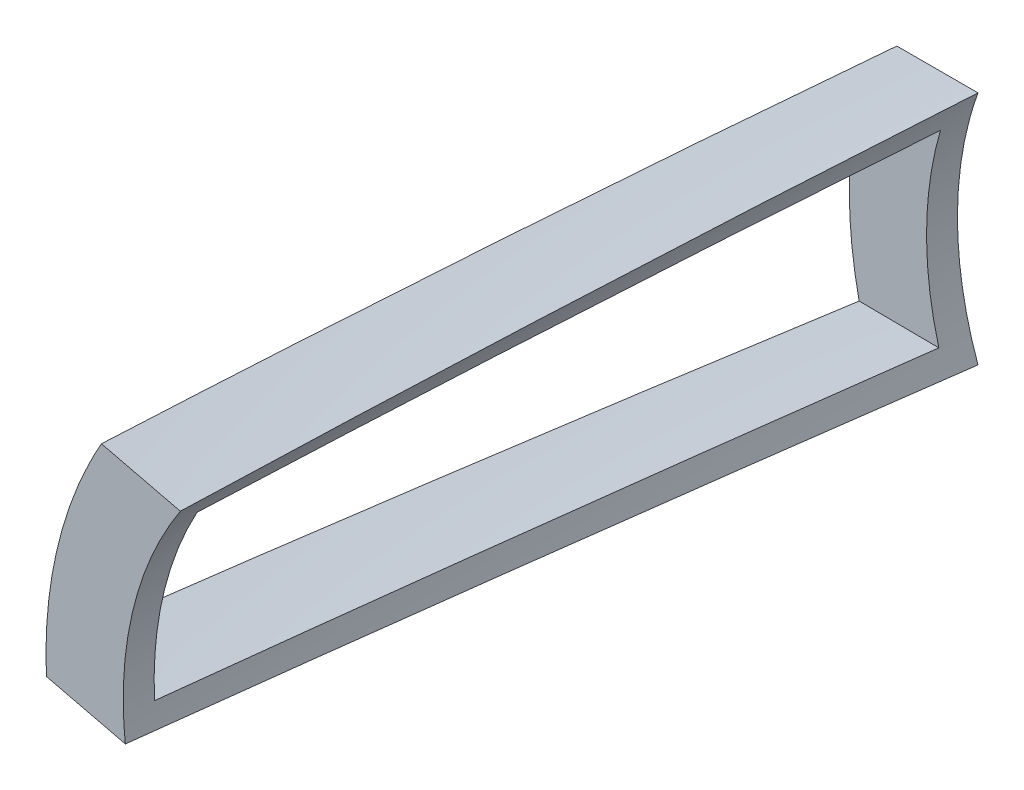
ISO-10303-21;
HEADER;
FILE_DESCRIPTION(('STEP AP214'),'2;1');
FILE_NAME('part.step','',(''),(''),'','','');
FILE_SCHEMA(('AUTOMOTIVE_DESIGN { 1 0 10303 214 1 1 1 1 }'));
ENDSEC;
DATA;
#1=APPLICATION_CONTEXT('core data for automotive mechanical design processes');
#2=APPLICATION_PROTOCOL_DEFINITION('international standard','automotive_design',2000,#1);
#3=PRODUCT_CONTEXT('',#1,'mechanical');
#4=PRODUCT('Part','Part','',(#3));
#5=PRODUCT_RELATED_PRODUCT_CATEGORY('part','',(#4));
#6=PRODUCT_DEFINITION_FORMATION('','',#4);
#7=PRODUCT_DEFINITION_CONTEXT('part definition',#1,'design');
#8=PRODUCT_DEFINITION('design','',#6,#7);
#9=PRODUCT_DEFINITION_SHAPE('','',#8);
#10=(LENGTH_UNIT() NAMED_UNIT(*) SI_UNIT(.MILLI.,.METRE.));
#11=(NAMED_UNIT(*) PLANE_ANGLE_UNIT() SI_UNIT($,.RADIAN.));
#12=(NAMED_UNIT(*) SI_UNIT($,.STERADIAN.) SOLID_ANGLE_UNIT());
#13=UNCERTAINTY_MEASURE_WITH_UNIT(LENGTH_MEASURE(1.E-05),#10,'distance_accuracy_value','');
#14=(GEOMETRIC_REPRESENTATION_CONTEXT(3) GLOBAL_UNCERTAINTY_ASSIGNED_CONTEXT((#13)) GLOBAL_UNIT_ASSIGNED_CONTEXT((#10,
#11,#12)) REPRESENTATION_CONTEXT('',''));
#15=CARTESIAN_POINT('',(0.,0.,0.));
#16=DIRECTION('',(0.,0.,1.));
#17=DIRECTION('',(1.,0.,0.));
#18=AXIS2_PLACEMENT_3D('',#15,#16,#17);
#19=CARTESIAN_POINT('',(-90.,0.,0.));
#20=DIRECTION('',(0.,0.,1.));
#21=DIRECTION('',(1.,0.,0.));
#22=AXIS2_PLACEMENT_3D('',#19,#20,#21);
#23=PLANE('',#22);
#24=CARTESIAN_POINT('',(-84.6743762894065,-30.5,0.));
#25=CARTESIAN_POINT('',(-91.8481142831322,-10.5842035973002,0.));
#26=CARTESIAN_POINT('',(-91.8481142831322,10.5842035973002,0.));
#27=CARTESIAN_POINT('',(-84.6743762894065,30.4999999999999,0.));
#28=(BOUNDED_CURVE() B_SPLINE_CURVE(3,(#24,#25,#26,#27),.UNSPECIFIED.,.F.,
.F.) B_SPLINE_CURVE_WITH_KNOTS((4,4),(0.,1.),
.UNSPECIFIED.) CURVE() GEOMETRIC_REPRESENTATION_ITEM() RATIONAL_B_SPLINE_CURVE((1.,
0.960550935477085,0.960550935477085,1.)) REPRESENTATION_ITEM(''));
#29=CARTESIAN_POINT('',(-84.6743762894065,-30.5,0.));
#30=VERTEX_POINT('',#29);
#31=CARTESIAN_POINT('',(-84.6743762894065,30.4999999999999,0.));
#32=VERTEX_POINT('',#31);
#33=EDGE_CURVE('E63',#30,#32,#28,.T.);
#34=ORIENTED_EDGE('',*,*,#33,.F.);
#35=CARTESIAN_POINT('',(-105.687037994259,-30.5,0.));
#36=CARTESIAN_POINT('',(-84.6743762894065,-30.5,0.));
#37=(BOUNDED_CURVE() B_SPLINE_CURVE(1,(#35,#36),.UNSPECIFIED.,.F.,
.F.) B_SPLINE_CURVE_WITH_KNOTS((2,2),(0.,1.),
.UNSPECIFIED.) CURVE() GEOMETRIC_REPRESENTATION_ITEM() RATIONAL_B_SPLINE_CURVE((1.,1.)) REPRESENTATION_ITEM(''));
#38=CARTESIAN_POINT('',(-105.687037994259,-30.4999999999999,0.));
#39=VERTEX_POINT('',#38);
#40=EDGE_CURVE('E300',#39,#30,#37,.T.);
#41=ORIENTED_EDGE('',*,*,#40,.F.);
#42=CARTESIAN_POINT('',(0.,0.,0.));
#43=DIRECTION('',(0.,0.,1.));
#44=DIRECTION('',(-0.960791254493266,0.277272727272727,0.));
#45=AXIS2_PLACEMENT_3D('',#42,#43,#44);
#46=CIRCLE('',#45,110.);
#47=CARTESIAN_POINT('',(-105.687037994259,30.5,0.));
#48=VERTEX_POINT('',#47);
#49=EDGE_CURVE('E295',#48,#39,#46,.T.);
#50=ORIENTED_EDGE('',*,*,#49,.F.);
#51=CARTESIAN_POINT('',(-84.6743762894065,30.5,0.));
#52=CARTESIAN_POINT('',(-105.687037994259,30.5,0.));
#53=(BOUNDED_CURVE() B_SPLINE_CURVE(1,(#51,#52),.UNSPECIFIED.,.F.,
.F.) B_SPLINE_CURVE_WITH_KNOTS((2,2),(0.,1.),
.UNSPECIFIED.) CURVE() GEOMETRIC_REPRESENTATION_ITEM() RATIONAL_B_SPLINE_CURVE((1.,1.)) REPRESENTATION_ITEM(''));
#54=EDGE_CURVE('E262',#32,#48,#53,.T.);
#55=ORIENTED_EDGE('',*,*,#54,.F.);
#56=EDGE_LOOP('',(#34,#41,#50,#55));
#57=FACE_BOUND('',#56,.T.);
#58=ADVANCED_FACE('F51',(#57),#23,.F.);
#59=CARTESIAN_POINT('',(-82.5484958033198,35.8572982893203,216.));
#60=DIRECTION('',(0.,0.,-1.));
#61=DIRECTION('',(-1.,0.,0.));
#62=AXIS2_PLACEMENT_3D('',#59,#60,#61);
#63=PLANE('',#62);
#64=CARTESIAN_POINT('',(-75.2147797046774,49.4240519785342,216.));
#65=CARTESIAN_POINT('',(-86.8395403434408,31.7331954914144,216.));
#66=CARTESIAN_POINT('',(-91.7811873850384,11.1496683963638,216.));
#67=CARTESIAN_POINT('',(-89.4548907704898,-9.89052664117212,216.));
#68=(BOUNDED_CURVE() B_SPLINE_CURVE(3,(#64,#65,#66,#67),.UNSPECIFIED.,.F.,
.F.) B_SPLINE_CURVE_WITH_KNOTS((4,4),(0.,1.),
.UNSPECIFIED.) CURVE() GEOMETRIC_REPRESENTATION_ITEM() RATIONAL_B_SPLINE_CURVE((0.999903611532343,
0.960458349444308,0.960458349444308,0.999903611532343)) REPRESENTATION_ITEM(''));
#69=CARTESIAN_POINT('',(-75.2147797046774,49.4240519785342,216.));
#70=VERTEX_POINT('',#69);
#71=CARTESIAN_POINT('',(-89.4548908369125,-9.8905260404119,216.000006156533));
#72=VERTEX_POINT('',#71);
#73=EDGE_CURVE('E12',#70,#72,#68,.T.);
#74=ORIENTED_EDGE('',*,*,#73,.F.);
#75=CARTESIAN_POINT('',(-95.6468640450545,54.329341964972,216.0000082815));
#76=CARTESIAN_POINT('',(-75.214779258191,49.4240526580085,216.0000082815));
#77=(BOUNDED_CURVE() B_SPLINE_CURVE(1,(#75,#76),.UNSPECIFIED.,.F.,
.F.) B_SPLINE_CURVE_WITH_KNOTS((2,2),(0.,1.),
.UNSPECIFIED.) CURVE() GEOMETRIC_REPRESENTATION_ITEM() RATIONAL_B_SPLINE_CURVE((0.999903611598851,0.999903611598851)) REPRESENTATION_ITEM(''));
#78=CARTESIAN_POINT('',(-95.6468640450545,54.329341964972,216.0000082815));
#79=VERTEX_POINT('',#78);
#80=EDGE_CURVE('E263',#79,#70,#77,.T.);
#81=ORIENTED_EDGE('',*,*,#80,.F.);
#82=CARTESIAN_POINT('',(-109.886975668626,-4.98523604283208,216.000012313066));
#83=CARTESIAN_POINT('',(-110.83322311462,15.8724062395083,216.000012313066));
#84=CARTESIAN_POINT('',(-105.959114025214,36.1746151437554,216.000012313066));
#85=CARTESIAN_POINT('',(-95.6468638061253,54.329342385607,216.000012313066));
#86=(BOUNDED_CURVE() B_SPLINE_CURVE(3,(#82,#83,#84,#85),.UNSPECIFIED.,.F.,
.F.) B_SPLINE_CURVE_WITH_KNOTS((4,4),(0.,1.),
.UNSPECIFIED.) CURVE() GEOMETRIC_REPRESENTATION_ITEM() RATIONAL_B_SPLINE_CURVE((0.999903611631228,
0.973766967471419,0.973766967471419,0.999903611631228)) REPRESENTATION_ITEM(''));
#87=CARTESIAN_POINT('',(-109.886975668626,-4.98523604283208,216.000012313066));
#88=VERTEX_POINT('',#87);
#89=EDGE_CURVE('E294',#88,#79,#86,.T.);
#90=ORIENTED_EDGE('',*,*,#89,.F.);
#91=CARTESIAN_POINT('',(-89.4548909033352,-9.89052543965167,216.000012313066));
#92=CARTESIAN_POINT('',(-109.886975668626,-4.98523604283213,216.000012313066));
#93=(BOUNDED_CURVE() B_SPLINE_CURVE(1,(#91,#92),.UNSPECIFIED.,.F.,
.F.) B_SPLINE_CURVE_WITH_KNOTS((2,2),(0.,1.),
.UNSPECIFIED.) CURVE() GEOMETRIC_REPRESENTATION_ITEM() RATIONAL_B_SPLINE_CURVE((0.999903611631228,0.999903611631228)) REPRESENTATION_ITEM(''));
#94=EDGE_CURVE('E316',#72,#88,#93,.T.);
#95=ORIENTED_EDGE('',*,*,#94,.F.);
#96=EDGE_LOOP('',(#74,#81,#90,#95));
#97=FACE_BOUND('',#96,.T.);
#98=ADVANCED_FACE('F53',(#97),#63,.F.);
#99=CARTESIAN_POINT('',(-84.6743762894065,-30.5,0.));
#100=CARTESIAN_POINT('',(-85.4231092637287,-28.4213607341624,22.5));
#101=CARTESIAN_POINT('',(-86.0689463618524,-26.3084866946119,45.));
#102=CARTESIAN_POINT('',(-86.7147834599761,-24.1956126550614,67.5));
#103=CARTESIAN_POINT('',(-87.2561688037633,-22.0535939404252,90.));
#104=CARTESIAN_POINT('',(-87.7975541475505,-19.911575225789,112.5));
#105=CARTESIAN_POINT('',(-88.2331834922882,-17.7455721467693,135.));
#106=CARTESIAN_POINT('',(-88.668812837026,-15.5795690677497,157.5));
#107=CARTESIAN_POINT('',(-88.9976367134661,-13.3947997154834,180.));
#108=CARTESIAN_POINT('',(-89.2606704549354,-11.6471527283015,197.998264746255));
#109=CARTESIAN_POINT('',(-89.4548907704898,-9.89052664117212,216.));
#110=CARTESIAN_POINT('',(-89.4665426557859,-9.78514113802853,217.079980504146));
#111=CARTESIAN_POINT('',(-89.4781945410821,-9.67975563488494,218.159961008292));
#112=CARTESIAN_POINT('',(-91.8481142831322,-10.5842035973002,0.));
#113=CARTESIAN_POINT('',(-92.1079418975662,-8.32945894834622,22.5));
#114=CARTESIAN_POINT('',(-92.2568214621332,-6.06468110130171,45.));
#115=CARTESIAN_POINT('',(-92.4057010267002,-3.7999032542572,67.5));
#116=CARTESIAN_POINT('',(-92.4432738774888,-1.53054825732683,90.));
#117=CARTESIAN_POINT('',(-92.4808467282774,0.738806739603545,112.5));
#118=CARTESIAN_POINT('',(-92.4070223489991,3.00727181146015,135.));
#119=CARTESIAN_POINT('',(-92.3331979697207,5.27573688331676,157.5));
#120=CARTESIAN_POINT('',(-92.1481542097713,7.53784709904742,180.));
#121=CARTESIAN_POINT('',(-92.0001334728286,9.34736081228869,197.998264746255));
#122=CARTESIAN_POINT('',(-91.7811873850384,11.1496683963638,216.));
#123=CARTESIAN_POINT('',(-91.7680521231907,11.2577944756466,217.079980504146));
#124=CARTESIAN_POINT('',(-91.7549168613429,11.3659205549295,218.159961008292));
#125=CARTESIAN_POINT('',(-91.8481142831322,10.5842035973002,0.));
#126=CARTESIAN_POINT('',(-91.5882866686981,12.8389482462542,22.5));
#127=CARTESIAN_POINT('',(-91.2181369518784,15.0782278197661,45.));
#128=CARTESIAN_POINT('',(-90.8479872350587,17.3175073932779,67.5));
#129=CARTESIAN_POINT('',(-90.3684071389424,19.5359272707174,90.));
#130=CARTESIAN_POINT('',(-89.8888270428261,21.7543471481568,112.5));
#131=CARTESIAN_POINT('',(-89.300971917871,23.9465629617284,135.));
#132=CARTESIAN_POINT('',(-88.713116792916,26.1387787752999,157.5));
#133=CARTESIAN_POINT('',(-88.0184028336082,28.2995092850934,180.));
#134=CARTESIAN_POINT('',(-87.4626852441619,30.0279270522299,197.998264746255));
#135=CARTESIAN_POINT('',(-86.8395403434408,31.7331954914144,216.));
#136=CARTESIAN_POINT('',(-86.8021559282969,31.8354998883347,217.079980504146));
#137=CARTESIAN_POINT('',(-86.764771513153,31.9378042852551,218.159961008292));
#138=CARTESIAN_POINT('',(-84.6743762894065,30.4999999999999,0.));
#139=CARTESIAN_POINT('',(-83.9256433150843,32.5786392658375,22.5));
#140=CARTESIAN_POINT('',(-83.0758182278799,34.6180361339035,45.));
#141=CARTESIAN_POINT('',(-82.2259931406756,36.6574330019696,67.5));
#142=CARTESIAN_POINT('',(-81.2771232436602,38.6526743865787,90.));
#143=CARTESIAN_POINT('',(-80.3282533466447,40.6479157711879,112.5));
#144=CARTESIAN_POINT('',(-79.2826245505112,42.5941949610822,135.));
#145=CARTESIAN_POINT('',(-78.2369957543777,44.5404741509765,157.5));
#146=CARTESIAN_POINT('',(-77.0971270704823,46.4331023891136,180.));
#147=CARTESIAN_POINT('',(-76.1853200327616,47.9470590156127,197.998264746255));
#148=CARTESIAN_POINT('',(-75.2147797046774,49.4240519785342,216.));
#149=CARTESIAN_POINT('',(-75.1565539493242,49.5126614143597,217.079980504146));
#150=CARTESIAN_POINT('',(-75.098328193971,49.6012708501853,218.159961008292));
#151=(BOUNDED_SURFACE() B_SPLINE_SURFACE(3,2,((#99,#100,#101,#102,#103,#104,#105,#106,#107,#108,
#109,#110,#111),(#112,#113,#114,#115,#116,#117,#118,#119,#120,#121,#122,#123,#124),(#125,#126,
#127,#128,#129,#130,#131,#132,#133,#134,#135,#136,#137),(#138,#139,#140,#141,#142,#143,#144,
#145,#146,#147,#148,#149,#150)),.UNSPECIFIED.,.F.,.F.,.F.) B_SPLINE_SURFACE_WITH_KNOTS((4,4),(3,
2,2,2,2,2,3),(0.,1.),(0.,0.0078125,0.015625,0.0234375,0.03125,0.0374997740895289,
0.0378747718304242),
.UNSPECIFIED.) GEOMETRIC_REPRESENTATION_ITEM() RATIONAL_B_SPLINE_SURFACE(((1.,0.999698818696204,
1.,0.999698818696204,1.,0.999698818696204,1.,0.999698818696204,1.,0.999759063666085,
0.999903611532343,0.999903611532343,0.999903611532343),(0.960550935477085,0.960261635493976,
0.960550935477085,0.960261635493976,0.960550935477085,0.960261635493976,0.960550935477085,
0.960261635493976,0.960550935477085,0.960319503856152,0.960458349444308,0.960458349444308,
0.960458349444308),(0.960550935477085,0.960261635493976,0.960550935477085,0.960261635493976,
0.960550935477085,0.960261635493976,0.960550935477085,0.960261635493976,0.960550935477085,
0.960319503856152,0.960458349444308,0.960458349444308,0.960458349444308),(1.,0.999698818696204,
1.,0.999698818696204,1.,0.999698818696204,1.,0.999698818696204,1.,0.999759063666085,
0.999903611532343,0.999903611532343,0.999903611532343))) REPRESENTATION_ITEM('') SURFACE());
#152=CARTESIAN_POINT('',(-86.6011197407635,-24.4999195844791,0.));
#153=CARTESIAN_POINT('',(-87.2025590083419,-22.3739814217533,22.5));
#154=CARTESIAN_POINT('',(-87.6989589745738,-20.2210928185403,45.));
#155=CARTESIAN_POINT('',(-88.1953589408056,-18.0682042153273,67.5));
#156=CARTESIAN_POINT('',(-88.5855237346928,-15.8935516688431,90.));
#157=CARTESIAN_POINT('',(-88.9756885285799,-13.7188991223589,112.5));
#158=CARTESIAN_POINT('',(-89.2586782089594,-11.527721561065,135.));
#159=CARTESIAN_POINT('',(-89.5416678893388,-9.33654399977105,157.5));
#160=CARTESIAN_POINT('',(-89.7168007092838,-7.13412016233707,180.));
#161=CARTESIAN_POINT('',(-89.8568934585782,-5.37235094857708,197.998264746255));
#162=CARTESIAN_POINT('',(-89.9277131377799,-3.60644004652252,216.));
#163=CARTESIAN_POINT('',(-89.9319618322402,-3.50049751823871,217.079980504146));
#164=CARTESIAN_POINT('',(-89.9362105267005,-3.39455498995491,218.159961008292));
#165=(BOUNDED_CURVE() B_SPLINE_CURVE(2,(#152,#153,#154,#155,#156,#157,#158,#159,#160,#161,#162,
#163,#164),.UNSPECIFIED.,.F.,.F.) B_SPLINE_CURVE_WITH_KNOTS((3,2,2,2,2,2,3),(0.,0.0078125,
0.015625,0.0234375,0.03125,0.0374997740895289,0.0378747718304242),
.UNSPECIFIED.) CURVE() GEOMETRIC_REPRESENTATION_ITEM() RATIONAL_B_SPLINE_CURVE((0.989089857107445,
0.98879196173471,0.989089857107445,0.98879196173471,0.989089857107445,0.98879196173471,
0.989089857107445,0.98879196173471,0.989089857107445,0.98885154942336,0.988994520251743,
0.988994520251743,0.988994520251743)) REPRESENTATION_ITEM(''));
#166=CARTESIAN_POINT('',(-86.8116434031464,-23.7431794342069,7.99998850867654));
#167=VERTEX_POINT('',#166);
#168=CARTESIAN_POINT('',(-89.8928189426009,-4.39102522798156,208.000007368579));
#169=VERTEX_POINT('',#168);
#170=EDGE_CURVE('E209',#167,#169,#165,.T.);
#171=CARTESIAN_POINT('',(-89.3651786248884,-10.6707473656625,207.999999999994));
#172=CARTESIAN_POINT('',(-91.8749866838556,10.3483469693357,207.999999999994));
#173=CARTESIAN_POINT('',(-87.1131428480972,30.9742119558098,207.999999999994));
#174=CARTESIAN_POINT('',(-75.6431979717875,48.7658343576829,207.999999999994));
#175=(BOUNDED_CURVE() B_SPLINE_CURVE(3,(#171,#172,#173,#174),.UNSPECIFIED.,.F.,
.F.) B_SPLINE_CURVE_WITH_KNOTS((4,4),(0.,1.),
.UNSPECIFIED.) CURVE() GEOMETRIC_REPRESENTATION_ITEM() RATIONAL_B_SPLINE_CURVE((0.999858405056304,
0.960414926321459,0.960414926321459,0.999858405056304)) REPRESENTATION_ITEM(''));
#176=CARTESIAN_POINT('',(-78.8701999503741,43.3531032313491,207.999999999994));
#177=VERTEX_POINT('',#176);
#178=EDGE_CURVE('E222',#177,#169,#175,.F.);
#179=CARTESIAN_POINT('',(-86.3839526884705,25.2549543241735,7.99999187350008));
#180=CARTESIAN_POINT('',(-85.8742408010512,26.9984113505613,26.5016252924337));
#181=CARTESIAN_POINT('',(-85.2945974872217,28.719882302907,45.));
#182=CARTESIAN_POINT('',(-84.5895639495548,30.8137471445538,67.5));
#183=CARTESIAN_POINT('',(-83.7826385775253,32.8704954782821,90.));
#184=CARTESIAN_POINT('',(-82.9757132054959,34.9272438120105,112.5));
#185=CARTESIAN_POINT('',(-82.0688399530033,36.9419207509346,135.));
#186=CARTESIAN_POINT('',(-81.1619667005107,38.9565976898588,157.5));
#187=CARTESIAN_POINT('',(-80.1573303046531,40.924349700768,180.));
#188=CARTESIAN_POINT('',(-79.5323117392318,42.1485553377868,193.998017372217));
#189=CARTESIAN_POINT('',(-78.8701999503741,43.3531032313491,207.999999999994));
#190=(BOUNDED_CURVE() B_SPLINE_CURVE(2,(#179,#180,#181,#182,#183,#184,#185,#186,#187,#188,#189),
.UNSPECIFIED.,.F.,.F.) B_SPLINE_CURVE_WITH_KNOTS((3,2,2,2,2,3),(0.00138910915697438,0.0078125,
0.015625,0.0234375,0.03125,0.0361109759076047),
.UNSPECIFIED.) CURVE() GEOMETRIC_REPRESENTATION_ITEM() RATIONAL_B_SPLINE_CURVE((0.999911940002985,
0.999752370530702,1.,0.999698818696204,1.,0.999698818696204,1.,0.999698818696204,1.,
0.999812603512119,0.999858405056304)) REPRESENTATION_ITEM(''));
#191=CARTESIAN_POINT('',(-86.3839526720266,25.2549543804195,7.99999247038403));
#192=VERTEX_POINT('',#191);
#193=EDGE_CURVE('E142',#192,#177,#190,.T.);
#194=CARTESIAN_POINT('',(-84.4049640862374,31.2378302319636,7.99999187350008));
#195=CARTESIAN_POINT('',(-91.7522430887485,11.3854007983736,7.99999187350008));
#196=CARTESIAN_POINT('',(-91.9369894136085,-9.78220019824056,7.99999187350008));
#197=CARTESIAN_POINT('',(-84.9373388517478,-29.7598465853467,7.99999187350008));
#198=(BOUNDED_CURVE() B_SPLINE_CURVE(3,(#194,#195,#196,#197),.UNSPECIFIED.,.F.,
.F.) B_SPLINE_CURVE_WITH_KNOTS((4,4),(0.,1.),
.UNSPECIFIED.) CURVE() GEOMETRIC_REPRESENTATION_ITEM() RATIONAL_B_SPLINE_CURVE((0.999911940002985,
0.960466349364574,0.960466349364574,0.999911940002985)) REPRESENTATION_ITEM(''));
#199=EDGE_CURVE('E70',#167,#192,#198,.F.);
#200=CARTESIAN_POINT('',(-84.6743762894065,30.4999999999999,0.));
#201=CARTESIAN_POINT('',(-83.9256433150843,32.5786392658375,22.5));
#202=CARTESIAN_POINT('',(-83.0758182278799,34.6180361339035,45.));
#203=CARTESIAN_POINT('',(-82.2259931406756,36.6574330019695,67.5));
#204=CARTESIAN_POINT('',(-81.2771232436602,38.6526743865787,90.));
#205=CARTESIAN_POINT('',(-80.3282533466447,40.6479157711879,112.5));
#206=CARTESIAN_POINT('',(-79.2826245505112,42.5941949610822,135.));
#207=CARTESIAN_POINT('',(-78.2369957543777,44.5404741509765,157.5));
#208=CARTESIAN_POINT('',(-77.0971270704823,46.4331023891136,180.));
#209=CARTESIAN_POINT('',(-76.1853200327617,47.9470590156127,197.998264746255));
#210=CARTESIAN_POINT('',(-75.2147797046775,49.4240519785341,216.));
#211=CARTESIAN_POINT('',(-75.1565539493242,49.5126614143597,217.079980504146));
#212=CARTESIAN_POINT('',(-75.098328193971,49.6012708501853,218.159961008292));
#213=(BOUNDED_CURVE() B_SPLINE_CURVE(2,(#200,#201,#202,#203,#204,#205,#206,#207,#208,#209,#210,
#211,#212),.UNSPECIFIED.,.F.,.F.) B_SPLINE_CURVE_WITH_KNOTS((3,2,2,2,2,2,3),(0.,0.0078125,
0.015625,0.0234375,0.03125,0.0374997740895289,0.0378747718304242),
.UNSPECIFIED.) CURVE() GEOMETRIC_REPRESENTATION_ITEM() RATIONAL_B_SPLINE_CURVE((1.,
0.999698818696204,1.,0.999698818696204,1.,0.999698818696204,1.,0.999698818696204,1.,
0.999759063666085,0.999903611532343,0.999903611532343,0.999903611532343)) REPRESENTATION_ITEM(''));
#214=EDGE_CURVE('E283',#32,#70,#213,.T.);
#215=CARTESIAN_POINT('',(-84.6743762894065,-30.5,0.));
#216=CARTESIAN_POINT('',(-85.4231092637287,-28.4213607341624,22.5));
#217=CARTESIAN_POINT('',(-86.0689463618524,-26.3084866946119,45.));
#218=CARTESIAN_POINT('',(-86.7147834599761,-24.1956126550614,67.5));
#219=CARTESIAN_POINT('',(-87.2561688037633,-22.0535939404252,90.));
#220=CARTESIAN_POINT('',(-87.7975541475505,-19.911575225789,112.5));
#221=CARTESIAN_POINT('',(-88.2331834922882,-17.7455721467693,135.));
#222=CARTESIAN_POINT('',(-88.668812837026,-15.5795690677497,157.5));
#223=CARTESIAN_POINT('',(-88.9976367134661,-13.3947997154834,180.));
#224=CARTESIAN_POINT('',(-89.2606705449267,-11.6471521303816,197.998270903975));
#225=CARTESIAN_POINT('',(-89.4548909033352,-9.89052543965167,216.000012313066));
#226=(BOUNDED_CURVE() B_SPLINE_CURVE(2,(#215,#216,#217,#218,#219,#220,#221,#222,#223,#224,#225),
.UNSPECIFIED.,.F.,.F.) B_SPLINE_CURVE_WITH_KNOTS((3,2,2,2,2,3),(0.,0.0078125,0.015625,0.0234375,
0.03125,0.0374997762272397),
.UNSPECIFIED.) CURVE() GEOMETRIC_REPRESENTATION_ITEM() RATIONAL_B_SPLINE_CURVE((1.,
0.999698818696204,1.,0.999698818696204,1.,0.999698818696204,1.,0.999698818696204,1.,
0.999759063583673,0.999903611631228)) REPRESENTATION_ITEM(''));
#227=EDGE_CURVE('E306',#30,#72,#226,.T.);
#228=ORIENTED_EDGE('',*,*,#170,.T.);
#229=ORIENTED_EDGE('',*,*,#178,.F.);
#230=ORIENTED_EDGE('',*,*,#193,.F.);
#231=ORIENTED_EDGE('',*,*,#199,.F.);
#232=EDGE_LOOP('',(#228,#229,#230,#231));
#233=FACE_BOUND('',#232,.T.);
#234=ORIENTED_EDGE('',*,*,#33,.T.);
#235=ORIENTED_EDGE('',*,*,#214,.T.);
#236=ORIENTED_EDGE('',*,*,#73,.T.);
#237=ORIENTED_EDGE('',*,*,#227,.F.);
#238=EDGE_LOOP('',(#234,#235,#236,#237));
#239=FACE_BOUND('',#238,.T.);
#240=ADVANCED_FACE('F260',(#233,#239),#151,.T.);
#241=CARTESIAN_POINT('',(-105.687037994259,-30.5,0.));
#242=CARTESIAN_POINT('',(-106.435770968581,-27.9055288424673,22.5));
#243=CARTESIAN_POINT('',(-107.056297395436,-25.277444253326,45.));
#244=CARTESIAN_POINT('',(-107.67682382229,-22.6493596641847,67.5));
#245=CARTESIAN_POINT('',(-108.167648799163,-19.9939929294031,90.));
#246=CARTESIAN_POINT('',(-108.658473776035,-17.3386261946215,112.5));
#247=CARTESIAN_POINT('',(-109.018414862565,-14.6623743252463,135.));
#248=CARTESIAN_POINT('',(-109.378355949095,-11.9861224558711,157.5));
#249=CARTESIAN_POINT('',(-109.606546015678,-9.29543277706768,180.));
#250=CARTESIAN_POINT('',(-109.789080532832,-7.14308781006177,197.998270903975));
#251=CARTESIAN_POINT('',(-109.886975668626,-4.98523604283213,216.000012313066));
#252=CARTESIAN_POINT('',(-84.6743762894065,-30.5,0.));
#253=CARTESIAN_POINT('',(-85.4231092637287,-28.4213607341624,22.5));
#254=CARTESIAN_POINT('',(-86.0689463618524,-26.3084866946119,45.));
#255=CARTESIAN_POINT('',(-86.7147834599761,-24.1956126550614,67.5));
#256=CARTESIAN_POINT('',(-87.2561688037633,-22.0535939404252,90.));
#257=CARTESIAN_POINT('',(-87.7975541475505,-19.911575225789,112.5));
#258=CARTESIAN_POINT('',(-88.2331834922882,-17.7455721467693,135.));
#259=CARTESIAN_POINT('',(-88.668812837026,-15.5795690677497,157.5));
#260=CARTESIAN_POINT('',(-88.9976367134661,-13.3947997154834,180.));
#261=CARTESIAN_POINT('',(-89.2606705449267,-11.6471521303816,197.998270903975));
#262=CARTESIAN_POINT('',(-89.4548909033352,-9.89052543965167,216.000012313066));
#263=(BOUNDED_SURFACE() B_SPLINE_SURFACE(1,2,((#241,#242,#243,#244,#245,#246,#247,#248,#249,
#250,#251),(#252,#253,#254,#255,#256,#257,#258,#259,#260,#261,#262)),.UNSPECIFIED.,.F.,.F.,
.F.) B_SPLINE_SURFACE_WITH_KNOTS((2,2),(3,2,2,2,2,3),(0.,1.),(0.,0.0078125,0.015625,0.0234375,
0.03125,0.0374997762272397),
.UNSPECIFIED.) GEOMETRIC_REPRESENTATION_ITEM() RATIONAL_B_SPLINE_SURFACE(((1.,0.999698818696204,
1.,0.999698818696204,1.,0.999698818696204,1.,0.999698818696204,1.,0.999759063583673,
0.999903611631228),(1.,0.999698818696204,1.,0.999698818696204,1.,0.999698818696204,1.,
0.999698818696204,1.,0.999759063583673,0.999903611631228))) REPRESENTATION_ITEM('') SURFACE());
#264=CARTESIAN_POINT('',(-105.687037994259,-30.4999999999999,0.));
#265=CARTESIAN_POINT('',(-106.435770968582,-27.9055288424672,22.5));
#266=CARTESIAN_POINT('',(-107.056297395436,-25.2774442533259,45.));
#267=CARTESIAN_POINT('',(-107.67682382229,-22.6493596641846,67.5));
#268=CARTESIAN_POINT('',(-108.167648799163,-19.993992929403,90.));
#269=CARTESIAN_POINT('',(-108.658473776035,-17.3386261946214,112.5));
#270=CARTESIAN_POINT('',(-109.018414862565,-14.6623743252462,135.));
#271=CARTESIAN_POINT('',(-109.378355949095,-11.9861224558711,157.5));
#272=CARTESIAN_POINT('',(-109.606546015678,-9.29543277706764,180.));
#273=CARTESIAN_POINT('',(-109.789080532832,-7.14308781006173,197.998270903975));
#274=CARTESIAN_POINT('',(-109.886975668626,-4.98523604283208,216.000012313066));
#275=(BOUNDED_CURVE() B_SPLINE_CURVE(2,(#264,#265,#266,#267,#268,#269,#270,#271,#272,#273,#274),
.UNSPECIFIED.,.F.,.F.) B_SPLINE_CURVE_WITH_KNOTS((3,2,2,2,2,3),(0.,0.0078125,0.015625,0.0234375,
0.03125,0.0374997762272397),
.UNSPECIFIED.) CURVE() GEOMETRIC_REPRESENTATION_ITEM() RATIONAL_B_SPLINE_CURVE((1.,
0.999698818696204,1.,0.999698818696204,1.,0.999698818696204,1.,0.999698818696204,1.,
0.999759063583673,0.999903611631228)) REPRESENTATION_ITEM(''));
#276=EDGE_CURVE('E288',#39,#88,#275,.T.);
#277=ORIENTED_EDGE('',*,*,#40,.T.);
#278=ORIENTED_EDGE('',*,*,#227,.T.);
#279=ORIENTED_EDGE('',*,*,#94,.T.);
#280=ORIENTED_EDGE('',*,*,#276,.F.);
#281=EDGE_LOOP('',(#277,#278,#279,#280));
#282=FACE_BOUND('',#281,.T.);
#283=ADVANCED_FACE('F173',(#282),#263,.T.);
#284=CARTESIAN_POINT('',(-105.687037994259,30.5,0.));
#285=CARTESIAN_POINT('',(-104.938305019937,33.0944711575327,22.5));
#286=CARTESIAN_POINT('',(-104.063169261463,35.6490785751895,45.));
#287=CARTESIAN_POINT('',(-103.18803350299,38.2036859928463,67.5));
#288=CARTESIAN_POINT('',(-102.188603239059,40.7122753976009,90.));
#289=CARTESIAN_POINT('',(-101.189172975129,43.2208648023555,112.5));
#290=CARTESIAN_POINT('',(-100.067855920788,45.6773927826053,135.));
#291=CARTESIAN_POINT('',(-98.9465388664469,48.1339207628551,157.5));
#292=CARTESIAN_POINT('',(-97.7060363726945,50.5324693275293,180.));
#293=CARTESIAN_POINT('',(-96.7137297087118,52.4511238539002,197.998270903975));
#294=CARTESIAN_POINT('',(-95.6468638061253,54.329342385607,216.000012313066));
#295=CARTESIAN_POINT('',(-111.476241726008,10.4395477129893,0.));
#296=CARTESIAN_POINT('',(-111.219965214214,13.1761358452443,22.5));
#297=CARTESIAN_POINT('',(-110.82971938346,15.8968527448271,45.));
#298=CARTESIAN_POINT('',(-110.439473552706,18.6175696444099,67.5));
#299=CARTESIAN_POINT('',(-109.91619853938,21.3158608660028,90.));
#300=CARTESIAN_POINT('',(-109.392923526054,24.0141520875956,112.5));
#301=CARTESIAN_POINT('',(-108.737879945496,26.6835172113033,135.));
#302=CARTESIAN_POINT('',(-108.082836364939,29.352882335011,157.5));
#303=CARTESIAN_POINT('',(-107.297602274511,31.9868906264418,180.));
#304=CARTESIAN_POINT('',(-106.669475346397,34.0938948394412,197.998270903975));
#305=CARTESIAN_POINT('',(-105.959114025214,36.1746151437554,216.000012313066));
#306=CARTESIAN_POINT('',(-111.476241726008,-10.4395477129893,0.));
#307=CARTESIAN_POINT('',(-111.732518237802,-7.7029595807343,22.5));
#308=CARTESIAN_POINT('',(-111.854208038073,-4.95709289631453,45.));
#309=CARTESIAN_POINT('',(-111.975897838343,-2.21122621189475,67.5));
#310=CARTESIAN_POINT('',(-111.962707765702,0.53730399133752,90.));
#311=CARTESIAN_POINT('',(-111.949517693061,3.28583419456979,112.5));
#312=CARTESIAN_POINT('',(-111.801479523549,6.03040646661217,135.));
#313=CARTESIAN_POINT('',(-111.653441354037,8.77497873865454,157.5));
#314=CARTESIAN_POINT('',(-111.370911724571,11.5089811645075,180.));
#315=CARTESIAN_POINT('',(-111.144909733036,13.6959730006242,197.998270903975));
#316=CARTESIAN_POINT('',(-110.83322311462,15.8724062395083,216.000012313066));
#317=CARTESIAN_POINT('',(-105.687037994259,-30.4999999999999,0.));
#318=CARTESIAN_POINT('',(-106.435770968582,-27.9055288424672,22.5));
#319=CARTESIAN_POINT('',(-107.056297395436,-25.2774442533259,45.));
#320=CARTESIAN_POINT('',(-107.67682382229,-22.6493596641846,67.5));
#321=CARTESIAN_POINT('',(-108.167648799163,-19.993992929403,90.));
#322=CARTESIAN_POINT('',(-108.658473776035,-17.3386261946214,112.5));
#323=CARTESIAN_POINT('',(-109.018414862565,-14.6623743252462,135.));
#324=CARTESIAN_POINT('',(-109.378355949095,-11.9861224558711,157.5));
#325=CARTESIAN_POINT('',(-109.606546015678,-9.29543277706764,180.));
#326=CARTESIAN_POINT('',(-109.789080532832,-7.14308781006173,197.998270903975));
#327=CARTESIAN_POINT('',(-109.886975668626,-4.98523604283208,216.000012313066));
#328=(BOUNDED_SURFACE() B_SPLINE_SURFACE(3,2,((#284,#285,#286,#287,#288,#289,#290,#291,#292,
#293,#294),(#295,#296,#297,#298,#299,#300,#301,#302,#303,#304,#305),(#306,#307,#308,#309,#310,
#311,#312,#313,#314,#315,#316),(#317,#318,#319,#320,#321,#322,#323,#324,#325,#326,#327)),
.UNSPECIFIED.,.F.,.F.,.F.) B_SPLINE_SURFACE_WITH_KNOTS((4,4),(3,2,2,2,2,3),(0.,1.),(0.,
0.0078125,0.015625,0.0234375,0.03125,0.0374997762272397),
.UNSPECIFIED.) GEOMETRIC_REPRESENTATION_ITEM() RATIONAL_B_SPLINE_SURFACE(((1.,0.999698818696204,
1.,0.999698818696204,1.,0.999698818696204,1.,0.999698818696204,1.,0.999759063583673,
0.999903611631228),(0.973860836328844,0.973567527652443,0.973860836328844,0.973567527652443,
0.973860836328844,0.973567527652443,0.973860836328844,0.973567527652443,0.973860836328844,
0.973626197788938,0.973766967471419),(0.973860836328844,0.973567527652443,0.973860836328844,
0.973567527652443,0.973860836328844,0.973567527652443,0.973860836328844,0.973567527652443,
0.973860836328844,0.973626197788938,0.973766967471419),(1.,0.999698818696204,1.,
0.999698818696204,1.,0.999698818696204,1.,0.999698818696204,1.,0.999759063583673,0.999903611631228))) REPRESENTATION_ITEM('') SURFACE());
#329=CARTESIAN_POINT('',(-105.949200552366,-29.5764585830425,8.));
#330=CARTESIAN_POINT('',(-111.563106926165,-9.4662452317788,8.));
#331=CARTESIAN_POINT('',(-111.380885371714,11.412055013026,8.));
#332=CARTESIAN_POINT('',(-105.41682524612,31.4212182295484,8.));
#333=(BOUNDED_CURVE() B_SPLINE_CURVE(3,(#329,#330,#331,#332),.UNSPECIFIED.,.F.,
.F.) B_SPLINE_CURVE_WITH_KNOTS((4,4),(0.,1.),
.UNSPECIFIED.) CURVE() GEOMETRIC_REPRESENTATION_ITEM() RATIONAL_B_SPLINE_CURVE((0.999911939932886,
0.973775078078237,0.973775078078237,0.999911939932886)) REPRESENTATION_ITEM(''));
#334=CARTESIAN_POINT('',(-107.018956910922,25.4350714899386,7.99999247038403));
#335=VERTEX_POINT('',#334);
#336=CARTESIAN_POINT('',(-107.446647790506,-23.5630617404218,7.99999425433827));
#337=VERTEX_POINT('',#336);
#338=EDGE_CURVE('E125',#335,#337,#333,.F.);
#339=CARTESIAN_POINT('',(-107.236864560186,24.5000995773541,0.));
#340=CARTESIAN_POINT('',(-106.635420874031,27.1326168415881,22.5));
#341=CARTESIAN_POINT('',(-105.905530153353,29.7324516805682,45.));
#342=CARTESIAN_POINT('',(-105.175639432674,32.3322865195483,67.5));
#343=CARTESIAN_POINT('',(-104.319060048151,34.8931757034286,90.));
#344=CARTESIAN_POINT('',(-103.462480663627,37.4540648873089,112.5));
#345=CARTESIAN_POINT('',(-102.481276190022,39.9698390097382,135.));
#346=CARTESIAN_POINT('',(-101.500071716418,42.4856131321675,157.5));
#347=CARTESIAN_POINT('',(-100.396605961252,44.950211472929,180.));
#348=CARTESIAN_POINT('',(-99.5139181570424,46.9217007443295,197.998270903975));
#349=CARTESIAN_POINT('',(-98.5545123729696,48.8570168033844,216.000012313066));
#350=(BOUNDED_CURVE() B_SPLINE_CURVE(2,(#339,#340,#341,#342,#343,#344,#345,#346,#347,#348,#349),
.UNSPECIFIED.,.F.,.F.) B_SPLINE_CURVE_WITH_KNOTS((3,2,2,2,2,3),(0.,0.0078125,0.015625,0.0234375,
0.03125,0.0374997762272397),
.UNSPECIFIED.) CURVE() GEOMETRIC_REPRESENTATION_ITEM() RATIONAL_B_SPLINE_CURVE((0.992865729446681,
0.992566696851793,0.992865729446681,0.992566696851793,0.992865729446681,0.992566696851793,
0.992865729446681,0.992566696851793,0.992865729446681,0.992626511935935,0.99277002873861)) REPRESENTATION_ITEM(''));
#351=CARTESIAN_POINT('',(-98.9770943600188,47.9951538391942,208.000004955951));
#352=VERTEX_POINT('',#351);
#353=EDGE_CURVE('E136',#335,#352,#350,.T.);
#354=CARTESIAN_POINT('',(-96.1173087655521,53.4926439397747,208.000007368579));
#355=CARTESIAN_POINT('',(-106.270745287429,35.2486215597364,208.000007368579));
#356=CARTESIAN_POINT('',(-110.967508458963,14.9046533746049,208.000007368579));
#357=CARTESIAN_POINT('',(-109.839289896358,-5.9439376732841,208.000007368579));
#358=(BOUNDED_CURVE() B_SPLINE_CURVE(3,(#354,#355,#356,#357),.UNSPECIFIED.,.F.,
.F.) B_SPLINE_CURVE_WITH_KNOTS((4,4),(0.,1.),
.UNSPECIFIED.) CURVE() GEOMETRIC_REPRESENTATION_ITEM() RATIONAL_B_SPLINE_CURVE((0.999858405080408,
0.973722942582031,0.973722942582031,0.999858405080408)) REPRESENTATION_ITEM(''));
#359=CARTESIAN_POINT('',(-109.999713574382,0.251025006430033,208.000007368579));
#360=VERTEX_POINT('',#359);
#361=EDGE_CURVE('E79',#360,#352,#358,.F.);
#362=CARTESIAN_POINT('',(-107.44664764282,-23.5630624138651,7.99998850867654));
#363=CARTESIAN_POINT('',(-107.922212712341,-21.39450420362,26.5016236096331));
#364=CARTESIAN_POINT('',(-108.309891640705,-19.2085234408791,45.));
#365=CARTESIAN_POINT('',(-108.781434423925,-16.5496648403328,67.5));
#366=CARTESIAN_POINT('',(-109.121945205318,-13.8708714436966,90.));
#367=CARTESIAN_POINT('',(-109.462455986711,-11.1920780470604,112.5));
#368=CARTESIAN_POINT('',(-109.671114445978,-8.49980330226133,135.));
#369=CARTESIAN_POINT('',(-109.879772905246,-5.80752855746229,157.5));
#370=CARTESIAN_POINT('',(-109.956076365883,-3.10825839017608,180.));
#371=CARTESIAN_POINT('',(-110.003547363602,-1.42894991735902,193.998021056326));
#372=CARTESIAN_POINT('',(-109.999713574382,0.251025006429975,208.000007368579));
#373=(BOUNDED_CURVE() B_SPLINE_CURVE(2,(#362,#363,#364,#365,#366,#367,#368,#369,#370,#371,#372),
.UNSPECIFIED.,.F.,.F.) B_SPLINE_CURVE_WITH_KNOTS((3,2,2,2,2,3),(0.001389108572782,0.0078125,
0.015625,0.0234375,0.03125,0.0361109771867149),
.UNSPECIFIED.) CURVE() GEOMETRIC_REPRESENTATION_ITEM() RATIONAL_B_SPLINE_CURVE((0.99991194003201,
0.99975237050818,1.,0.999698818696204,1.,0.999698818696204,1.,0.999698818696204,1.,
0.999812603462808,0.999858405080408)) REPRESENTATION_ITEM(''));
#374=EDGE_CURVE('E149',#337,#360,#373,.T.);
#375=CARTESIAN_POINT('',(-105.687037994259,30.5,0.));
#376=CARTESIAN_POINT('',(-104.938305019937,33.0944711575327,22.5));
#377=CARTESIAN_POINT('',(-104.063169261463,35.6490785751895,45.));
#378=CARTESIAN_POINT('',(-103.18803350299,38.2036859928463,67.5));
#379=CARTESIAN_POINT('',(-102.188603239059,40.7122753976009,90.));
#380=CARTESIAN_POINT('',(-101.189172975129,43.2208648023555,112.5));
#381=CARTESIAN_POINT('',(-100.067855920788,45.6773927826053,135.));
#382=CARTESIAN_POINT('',(-98.9465388664469,48.1339207628551,157.5));
#383=CARTESIAN_POINT('',(-97.7060363726945,50.5324693275293,180.));
#384=CARTESIAN_POINT('',(-96.7137298198703,52.451123638972,197.998268887803));
#385=CARTESIAN_POINT('',(-95.6468640450545,54.329341964972,216.0000082815));
#386=(BOUNDED_CURVE() B_SPLINE_CURVE(2,(#375,#376,#377,#378,#379,#380,#381,#382,#383,#384,#385),
.UNSPECIFIED.,.F.,.F.) B_SPLINE_CURVE_WITH_KNOTS((3,2,2,2,2,3),(0.,0.0078125,0.015625,0.0234375,
0.03125,0.0374997755273066),
.UNSPECIFIED.) CURVE() GEOMETRIC_REPRESENTATION_ITEM() RATIONAL_B_SPLINE_CURVE((1.,
0.999698818696204,1.,0.999698818696204,1.,0.999698818696204,1.,0.999698818696204,1.,
0.999759063610657,0.999903611598851)) REPRESENTATION_ITEM(''));
#387=EDGE_CURVE('E269',#48,#79,#386,.T.);
#388=ORIENTED_EDGE('',*,*,#338,.F.);
#389=ORIENTED_EDGE('',*,*,#353,.T.);
#390=ORIENTED_EDGE('',*,*,#361,.F.);
#391=ORIENTED_EDGE('',*,*,#374,.F.);
#392=EDGE_LOOP('',(#388,#389,#390,#391));
#393=FACE_BOUND('',#392,.T.);
#394=ORIENTED_EDGE('',*,*,#49,.T.);
#395=ORIENTED_EDGE('',*,*,#276,.T.);
#396=ORIENTED_EDGE('',*,*,#89,.T.);
#397=ORIENTED_EDGE('',*,*,#387,.F.);
#398=EDGE_LOOP('',(#394,#395,#396,#397));
#399=FACE_BOUND('',#398,.T.);
#400=ADVANCED_FACE('F147',(#393,#399),#328,.T.);
#401=CARTESIAN_POINT('',(-84.6743762894065,30.5,0.));
#402=CARTESIAN_POINT('',(-83.9256433150843,32.5786392658376,22.5));
#403=CARTESIAN_POINT('',(-83.0758182278799,34.6180361339036,45.));
#404=CARTESIAN_POINT('',(-82.2259931406756,36.6574330019696,67.5));
#405=CARTESIAN_POINT('',(-81.2771232436601,38.6526743865788,90.));
#406=CARTESIAN_POINT('',(-80.3282533466447,40.6479157711879,112.5));
#407=CARTESIAN_POINT('',(-79.2826245505112,42.5941949610822,135.));
#408=CARTESIAN_POINT('',(-78.2369957543777,44.5404741509766,157.5));
#409=CARTESIAN_POINT('',(-77.0971270704823,46.4331023891136,180.));
#410=CARTESIAN_POINT('',(-76.1853198229474,47.9470593639865,197.998268887803));
#411=CARTESIAN_POINT('',(-75.214779258191,49.4240526580085,216.0000082815));
#412=CARTESIAN_POINT('',(-105.687037994259,30.5,0.));
#413=CARTESIAN_POINT('',(-104.938305019937,33.0944711575327,22.5));
#414=CARTESIAN_POINT('',(-104.063169261463,35.6490785751895,45.));
#415=CARTESIAN_POINT('',(-103.18803350299,38.2036859928463,67.5));
#416=CARTESIAN_POINT('',(-102.188603239059,40.7122753976009,90.));
#417=CARTESIAN_POINT('',(-101.189172975129,43.2208648023555,112.5));
#418=CARTESIAN_POINT('',(-100.067855920788,45.6773927826053,135.));
#419=CARTESIAN_POINT('',(-98.9465388664469,48.1339207628551,157.5));
#420=CARTESIAN_POINT('',(-97.7060363726945,50.5324693275293,180.));
#421=CARTESIAN_POINT('',(-96.7137298198703,52.451123638972,197.998268887803));
#422=CARTESIAN_POINT('',(-95.6468640450545,54.329341964972,216.0000082815));
#423=(BOUNDED_SURFACE() B_SPLINE_SURFACE(1,2,((#401,#402,#403,#404,#405,#406,#407,#408,#409,
#410,#411),(#412,#413,#414,#415,#416,#417,#418,#419,#420,#421,#422)),.UNSPECIFIED.,.F.,.F.,
.F.) B_SPLINE_SURFACE_WITH_KNOTS((2,2),(3,2,2,2,2,3),(0.,1.),(0.,0.0078125,0.015625,0.0234375,
0.03125,0.0374997755273066),
.UNSPECIFIED.) GEOMETRIC_REPRESENTATION_ITEM() RATIONAL_B_SPLINE_SURFACE(((1.,0.999698818696204,
1.,0.999698818696204,1.,0.999698818696204,1.,0.999698818696204,1.,0.999759063610657,
0.999903611598851),(1.,0.999698818696204,1.,0.999698818696204,1.,0.999698818696204,1.,
0.999698818696204,1.,0.999759063610657,0.999903611598851))) REPRESENTATION_ITEM('') SURFACE());
#424=ORIENTED_EDGE('',*,*,#54,.T.);
#425=ORIENTED_EDGE('',*,*,#387,.T.);
#426=ORIENTED_EDGE('',*,*,#80,.T.);
#427=ORIENTED_EDGE('',*,*,#214,.F.);
#428=EDGE_LOOP('',(#424,#425,#426,#427));
#429=FACE_BOUND('',#428,.T.);
#430=ADVANCED_FACE('F172',(#429),#423,.T.);
#431=CARTESIAN_POINT('',(-89.2431306373169,-11.6474732904089,7.99999187350008));
#432=DIRECTION('',(0.,0.,1.));
#433=DIRECTION('',(1.,0.,0.));
#434=AXIS2_PLACEMENT_3D('',#431,#432,#433);
#435=PLANE('',#434);
#436=ORIENTED_EDGE('',*,*,#199,.T.);
#437=CARTESIAN_POINT('',(-107.018956910922,25.4350714899386,7.99999247038403));
#438=CARTESIAN_POINT('',(-86.3839526720266,25.2549543804195,7.99999247038403));
#439=(BOUNDED_CURVE() B_SPLINE_CURVE(1,(#437,#438),.UNSPECIFIED.,.F.,
.F.) B_SPLINE_CURVE_WITH_KNOTS((2,2),(0.,1.),
.UNSPECIFIED.) CURVE() GEOMETRIC_REPRESENTATION_ITEM() RATIONAL_B_SPLINE_CURVE((0.999911939997836,0.999911939997836)) REPRESENTATION_ITEM(''));
#440=EDGE_CURVE('E120',#192,#335,#439,.F.);
#441=ORIENTED_EDGE('',*,*,#440,.T.);
#442=ORIENTED_EDGE('',*,*,#338,.T.);
#443=CARTESIAN_POINT('',(-86.8116434031464,-23.7431794342069,7.99998850867654));
#444=CARTESIAN_POINT('',(-107.44664764282,-23.5630624138651,7.99998850867654));
#445=(BOUNDED_CURVE() B_SPLINE_CURVE(1,(#443,#444),.UNSPECIFIED.,.F.,
.F.) B_SPLINE_CURVE_WITH_KNOTS((2,2),(0.,1.),
.UNSPECIFIED.) CURVE() GEOMETRIC_REPRESENTATION_ITEM() RATIONAL_B_SPLINE_CURVE((0.99991194003201,0.99991194003201)) REPRESENTATION_ITEM(''));
#446=EDGE_CURVE('E208',#337,#167,#445,.F.);
#447=ORIENTED_EDGE('',*,*,#446,.T.);
#448=EDGE_LOOP('',(#436,#441,#442,#447));
#449=FACE_BOUND('',#448,.T.);
#450=ADVANCED_FACE('F123',(#449),#435,.T.);
#451=CARTESIAN_POINT('',(-84.0582161055575,32.1592335908585,207.999999999994));
#452=DIRECTION('',(0.,0.,-1.));
#453=DIRECTION('',(-1.,0.,0.));
#454=AXIS2_PLACEMENT_3D('',#451,#452,#453);
#455=PLANE('',#454);
#456=ORIENTED_EDGE('',*,*,#178,.T.);
#457=CARTESIAN_POINT('',(-109.999713574382,0.251025006429975,208.000007368579));
#458=CARTESIAN_POINT('',(-89.8928189426009,-4.39102522798156,208.000007368579));
#459=(BOUNDED_CURVE() B_SPLINE_CURVE(1,(#457,#458),.UNSPECIFIED.,.F.,
.F.) B_SPLINE_CURVE_WITH_KNOTS((2,2),(0.,1.),
.UNSPECIFIED.) CURVE() GEOMETRIC_REPRESENTATION_ITEM() RATIONAL_B_SPLINE_CURVE((0.999858405080408,0.999858405080408)) REPRESENTATION_ITEM(''));
#460=EDGE_CURVE('E214',#169,#360,#459,.F.);
#461=ORIENTED_EDGE('',*,*,#460,.T.);
#462=ORIENTED_EDGE('',*,*,#361,.T.);
#463=CARTESIAN_POINT('',(-78.8701997160217,43.3531036576951,208.000004955951));
#464=CARTESIAN_POINT('',(-98.9770943600188,47.9951538391942,208.000004955951));
#465=(BOUNDED_CURVE() B_SPLINE_CURVE(1,(#463,#464),.UNSPECIFIED.,.F.,
.F.) B_SPLINE_CURVE_WITH_KNOTS((2,2),(0.,1.),
.UNSPECIFIED.) CURVE() GEOMETRIC_REPRESENTATION_ITEM() RATIONAL_B_SPLINE_CURVE((0.999858405072516,0.999858405072516)) REPRESENTATION_ITEM(''));
#466=EDGE_CURVE('E132',#352,#177,#465,.F.);
#467=ORIENTED_EDGE('',*,*,#466,.T.);
#468=EDGE_LOOP('',(#456,#461,#462,#467));
#469=FACE_BOUND('',#468,.T.);
#470=ADVANCED_FACE('F221',(#469),#455,.T.);
#471=CARTESIAN_POINT('',(-107.44664764282,-23.5630624138651,7.99998850867654));
#472=CARTESIAN_POINT('',(-107.922212712341,-21.39450420362,26.5016236096331));
#473=CARTESIAN_POINT('',(-108.309891640705,-19.2085234408791,45.));
#474=CARTESIAN_POINT('',(-108.781434423925,-16.5496648403328,67.5));
#475=CARTESIAN_POINT('',(-109.121945205318,-13.8708714436966,90.));
#476=CARTESIAN_POINT('',(-109.462455986711,-11.1920780470604,112.5));
#477=CARTESIAN_POINT('',(-109.671114445978,-8.49980330226133,135.));
#478=CARTESIAN_POINT('',(-109.879772905246,-5.80752855746229,157.5));
#479=CARTESIAN_POINT('',(-109.956076365883,-3.10825839017608,180.));
#480=CARTESIAN_POINT('',(-110.003547363602,-1.42894991735902,193.998021056326));
#481=CARTESIAN_POINT('',(-109.999713574382,0.251025006429975,208.000007368579));
#482=CARTESIAN_POINT('',(-86.8116434031464,-23.7431794342069,7.99998850867654));
#483=CARTESIAN_POINT('',(-87.2908437116617,-21.9910903167076,26.5016236096331));
#484=CARTESIAN_POINT('',(-87.6989589745738,-20.2210928185403,45.));
#485=CARTESIAN_POINT('',(-88.1953589408057,-18.0682042153273,67.5));
#486=CARTESIAN_POINT('',(-88.5855237346928,-15.8935516688431,90.));
#487=CARTESIAN_POINT('',(-88.9756885285799,-13.7188991223589,112.5));
#488=CARTESIAN_POINT('',(-89.2586782089594,-11.527721561065,135.));
#489=CARTESIAN_POINT('',(-89.5416678893389,-9.33654399977105,157.5));
#490=CARTESIAN_POINT('',(-89.7168007092837,-7.13412016233707,180.));
#491=CARTESIAN_POINT('',(-89.8257568382278,-5.76391681783243,193.998021056326));
#492=CARTESIAN_POINT('',(-89.8928189426009,-4.39102522798156,208.000007368579));
#493=(BOUNDED_SURFACE() B_SPLINE_SURFACE(1,2,((#471,#472,#473,#474,#475,#476,#477,#478,#479,
#480,#481),(#482,#483,#484,#485,#486,#487,#488,#489,#490,#491,#492)),.UNSPECIFIED.,.F.,.F.,
.F.) B_SPLINE_SURFACE_WITH_KNOTS((2,2),(3,2,2,2,2,3),(0.,1.),(0.001389108572782,0.0078125,
0.015625,0.0234375,0.03125,0.0361109771867149),
.UNSPECIFIED.) GEOMETRIC_REPRESENTATION_ITEM() RATIONAL_B_SPLINE_SURFACE(((0.99991194003201,
0.99975237050818,1.,0.999698818696204,1.,0.999698818696204,1.,0.999698818696204,1.,
0.999812603462808,0.999858405080408),(0.99991194003201,0.99975237050818,1.,0.999698818696204,1.,
0.999698818696204,1.,0.999698818696204,1.,0.999812603462808,0.999858405080408))) REPRESENTATION_ITEM('') SURFACE());
#494=ORIENTED_EDGE('',*,*,#446,.F.);
#495=ORIENTED_EDGE('',*,*,#374,.T.);
#496=ORIENTED_EDGE('',*,*,#460,.F.);
#497=ORIENTED_EDGE('',*,*,#170,.F.);
#498=EDGE_LOOP('',(#494,#495,#496,#497));
#499=FACE_BOUND('',#498,.T.);
#500=ADVANCED_FACE('F212',(#499),#493,.F.);
#501=CARTESIAN_POINT('',(-86.3839526720266,25.2549543804195,7.99999247038403));
#502=CARTESIAN_POINT('',(-85.8742407916974,26.9984113783409,26.5016255909447));
#503=CARTESIAN_POINT('',(-85.2945974872217,28.7198823029071,45.));
#504=CARTESIAN_POINT('',(-84.5895639495548,30.8137471445538,67.5));
#505=CARTESIAN_POINT('',(-83.7826385775253,32.8704954782821,90.));
#506=CARTESIAN_POINT('',(-82.9757132054959,34.9272438120105,112.5));
#507=CARTESIAN_POINT('',(-82.0688399530033,36.9419207509346,135.));
#508=CARTESIAN_POINT('',(-81.1619667005107,38.9565976898588,157.5));
#509=CARTESIAN_POINT('',(-80.1573303046531,40.924349700768,180.));
#510=CARTESIAN_POINT('',(-79.5323116285944,42.1485555544892,193.998019850072));
#511=CARTESIAN_POINT('',(-78.8701997160217,43.3531036576951,208.000004955951));
#512=CARTESIAN_POINT('',(-107.018956910922,25.4350714899386,7.99999247038403));
#513=CARTESIAN_POINT('',(-106.505609790188,27.5949975359833,26.5016255909447));
#514=CARTESIAN_POINT('',(-105.905530153353,29.7324516805682,45.));
#515=CARTESIAN_POINT('',(-105.175639432674,32.3322865195482,67.5));
#516=CARTESIAN_POINT('',(-104.319060048151,34.8931757034286,90.));
#517=CARTESIAN_POINT('',(-103.462480663627,37.4540648873089,112.5));
#518=CARTESIAN_POINT('',(-102.481276190022,39.9698390097382,135.));
#519=CARTESIAN_POINT('',(-101.500071716418,42.4856131321675,157.5));
#520=CARTESIAN_POINT('',(-100.396605961252,44.950211472929,180.));
#521=CARTESIAN_POINT('',(-99.7101021592666,46.483522428326,193.998019850072));
#522=CARTESIAN_POINT('',(-98.9770943600188,47.9951538391942,208.000004955951));
#523=(BOUNDED_SURFACE() B_SPLINE_SURFACE(1,2,((#501,#502,#503,#504,#505,#506,#507,#508,#509,
#510,#511),(#512,#513,#514,#515,#516,#517,#518,#519,#520,#521,#522)),.UNSPECIFIED.,.F.,.F.,
.F.) B_SPLINE_SURFACE_WITH_KNOTS((2,2),(3,2,2,2,2,3),(0.,1.),(0.0013891092606039,0.0078125,
0.015625,0.0234375,0.03125,0.0361109767679077),
.UNSPECIFIED.) GEOMETRIC_REPRESENTATION_ITEM() RATIONAL_B_SPLINE_SURFACE(((0.999911939997836,
0.999752370534697,1.,0.999698818696204,1.,0.999698818696204,1.,0.999698818696204,1.,
0.999812603478953,0.999858405072516),(0.999911939997836,0.999752370534697,1.,0.999698818696204,
1.,0.999698818696204,1.,0.999698818696204,1.,0.999812603478953,0.999858405072516))) REPRESENTATION_ITEM('') SURFACE());
#524=ORIENTED_EDGE('',*,*,#440,.F.);
#525=ORIENTED_EDGE('',*,*,#193,.T.);
#526=ORIENTED_EDGE('',*,*,#466,.F.);
#527=ORIENTED_EDGE('',*,*,#353,.F.);
#528=EDGE_LOOP('',(#524,#525,#526,#527));
#529=FACE_BOUND('',#528,.T.);
#530=ADVANCED_FACE('F138',(#529),#523,.F.);
#531=CLOSED_SHELL('',(#58,#98,#240,#283,#400,#430,#450,#470,#500,#530));
#532=MANIFOLD_SOLID_BREP('B2',#531);
#533=ADVANCED_BREP_SHAPE_REPRESENTATION('',(#18,#532),#14);
#534=SHAPE_DEFINITION_REPRESENTATION(#9,#533);
ENDSEC;
END-ISO-10303-21;
